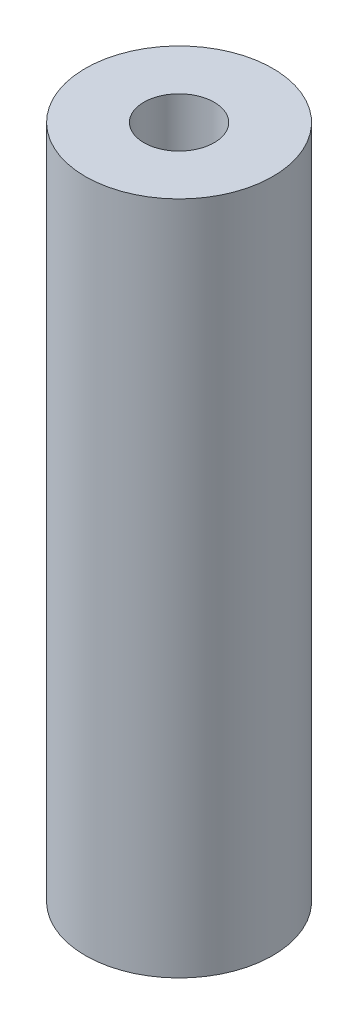
ISO-10303-21;
HEADER;
FILE_DESCRIPTION(('STEP AP214'),'2;1');
FILE_NAME('part.step','',(''),(''),'','','');
FILE_SCHEMA(('AUTOMOTIVE_DESIGN { 1 0 10303 214 1 1 1 1 }'));
ENDSEC;
DATA;
#1=APPLICATION_CONTEXT('core data for automotive mechanical design processes');
#2=APPLICATION_PROTOCOL_DEFINITION('international standard','automotive_design',2000,#1);
#3=PRODUCT_CONTEXT('',#1,'mechanical');
#4=PRODUCT('Part','Part','',(#3));
#5=PRODUCT_RELATED_PRODUCT_CATEGORY('part','',(#4));
#6=PRODUCT_DEFINITION_FORMATION('','',#4);
#7=PRODUCT_DEFINITION_CONTEXT('part definition',#1,'design');
#8=PRODUCT_DEFINITION('design','',#6,#7);
#9=PRODUCT_DEFINITION_SHAPE('','',#8);
#10=(LENGTH_UNIT() NAMED_UNIT(*) SI_UNIT(.MILLI.,.METRE.));
#11=(NAMED_UNIT(*) PLANE_ANGLE_UNIT() SI_UNIT($,.RADIAN.));
#12=(NAMED_UNIT(*) SI_UNIT($,.STERADIAN.) SOLID_ANGLE_UNIT());
#13=UNCERTAINTY_MEASURE_WITH_UNIT(LENGTH_MEASURE(1.E-05),#10,'distance_accuracy_value','');
#14=(GEOMETRIC_REPRESENTATION_CONTEXT(3) GLOBAL_UNCERTAINTY_ASSIGNED_CONTEXT((#13)) GLOBAL_UNIT_ASSIGNED_CONTEXT((#10,
#11,#12)) REPRESENTATION_CONTEXT('',''));
#15=CARTESIAN_POINT('',(0.,0.,0.));
#16=DIRECTION('',(0.,0.,1.));
#17=DIRECTION('',(1.,0.,0.));
#18=AXIS2_PLACEMENT_3D('',#15,#16,#17);
#19=CARTESIAN_POINT('',(0.,28.8,0.));
#20=DIRECTION('',(0.,1.,0.));
#21=DIRECTION('',(0.,0.,1.));
#22=AXIS2_PLACEMENT_3D('',#19,#20,#21);
#23=PLANE('',#22);
#24=CARTESIAN_POINT('',(0.,28.8,0.));
#25=DIRECTION('',(0.,1.,0.));
#26=DIRECTION('',(0.,0.,1.));
#27=AXIS2_PLACEMENT_3D('',#24,#25,#26);
#28=CIRCLE('',#27,4.);
#29=CARTESIAN_POINT('',(0.,28.8,4.));
#30=VERTEX_POINT('',#29);
#31=EDGE_CURVE('E10',#30,#30,#28,.T.);
#32=ORIENTED_EDGE('',*,*,#31,.T.);
#33=EDGE_LOOP('',(#32));
#34=FACE_BOUND('',#33,.T.);
#35=CARTESIAN_POINT('',(0.,28.8,0.));
#36=DIRECTION('',(0.,1.,0.));
#37=DIRECTION('',(0.,0.,1.));
#38=AXIS2_PLACEMENT_3D('',#35,#36,#37);
#39=CIRCLE('',#38,1.5);
#40=CARTESIAN_POINT('',(0.,28.8,1.5));
#41=VERTEX_POINT('',#40);
#42=EDGE_CURVE('E41',#41,#41,#39,.T.);
#43=ORIENTED_EDGE('',*,*,#42,.F.);
#44=EDGE_LOOP('',(#43));
#45=FACE_BOUND('',#44,.T.);
#46=ADVANCED_FACE('F30',(#34,#45),#23,.T.);
#47=CARTESIAN_POINT('',(0.,0.,0.));
#48=DIRECTION('',(0.,1.,0.));
#49=DIRECTION('',(0.,0.,1.));
#50=AXIS2_PLACEMENT_3D('',#47,#48,#49);
#51=PLANE('',#50);
#52=CARTESIAN_POINT('',(0.,0.,0.));
#53=DIRECTION('',(0.,1.,0.));
#54=DIRECTION('',(0.,0.,1.));
#55=AXIS2_PLACEMENT_3D('',#52,#53,#54);
#56=CIRCLE('',#55,4.);
#57=CARTESIAN_POINT('',(0.,0.,4.));
#58=VERTEX_POINT('',#57);
#59=EDGE_CURVE('E34',#58,#58,#56,.T.);
#60=ORIENTED_EDGE('',*,*,#59,.F.);
#61=EDGE_LOOP('',(#60));
#62=FACE_BOUND('',#61,.T.);
#63=CARTESIAN_POINT('',(0.,0.,0.));
#64=DIRECTION('',(0.,1.,0.));
#65=DIRECTION('',(0.,0.,1.));
#66=AXIS2_PLACEMENT_3D('',#63,#64,#65);
#67=CIRCLE('',#66,1.5);
#68=CARTESIAN_POINT('',(0.,0.,1.5));
#69=VERTEX_POINT('',#68);
#70=EDGE_CURVE('E43',#69,#69,#67,.T.);
#71=ORIENTED_EDGE('',*,*,#70,.T.);
#72=EDGE_LOOP('',(#71));
#73=FACE_BOUND('',#72,.T.);
#74=ADVANCED_FACE('F53',(#62,#73),#51,.F.);
#75=CARTESIAN_POINT('',(0.,28.8,0.));
#76=DIRECTION('',(0.,-1.,0.));
#77=DIRECTION('',(0.,0.,-1.));
#78=AXIS2_PLACEMENT_3D('',#75,#76,#77);
#79=CYLINDRICAL_SURFACE('',#78,4.);
#80=ORIENTED_EDGE('',*,*,#31,.F.);
#81=EDGE_LOOP('',(#80));
#82=FACE_BOUND('',#81,.T.);
#83=ORIENTED_EDGE('',*,*,#59,.T.);
#84=EDGE_LOOP('',(#83));
#85=FACE_BOUND('',#84,.T.);
#86=ADVANCED_FACE('F32',(#82,#85),#79,.T.);
#87=CARTESIAN_POINT('',(0.,28.8,0.));
#88=DIRECTION('',(0.,-1.,0.));
#89=DIRECTION('',(0.,0.,-1.));
#90=AXIS2_PLACEMENT_3D('',#87,#88,#89);
#91=CYLINDRICAL_SURFACE('',#90,1.5);
#92=ORIENTED_EDGE('',*,*,#42,.T.);
#93=EDGE_LOOP('',(#92));
#94=FACE_BOUND('',#93,.T.);
#95=ORIENTED_EDGE('',*,*,#70,.F.);
#96=EDGE_LOOP('',(#95));
#97=FACE_BOUND('',#96,.T.);
#98=ADVANCED_FACE('F49',(#94,#97),#91,.F.);
#99=CLOSED_SHELL('',(#46,#74,#86,#98));
#100=MANIFOLD_SOLID_BREP('B2',#99);
#101=ADVANCED_BREP_SHAPE_REPRESENTATION('',(#18,#100),#14);
#102=SHAPE_DEFINITION_REPRESENTATION(#9,#101);
ENDSEC;
END-ISO-10303-21;
